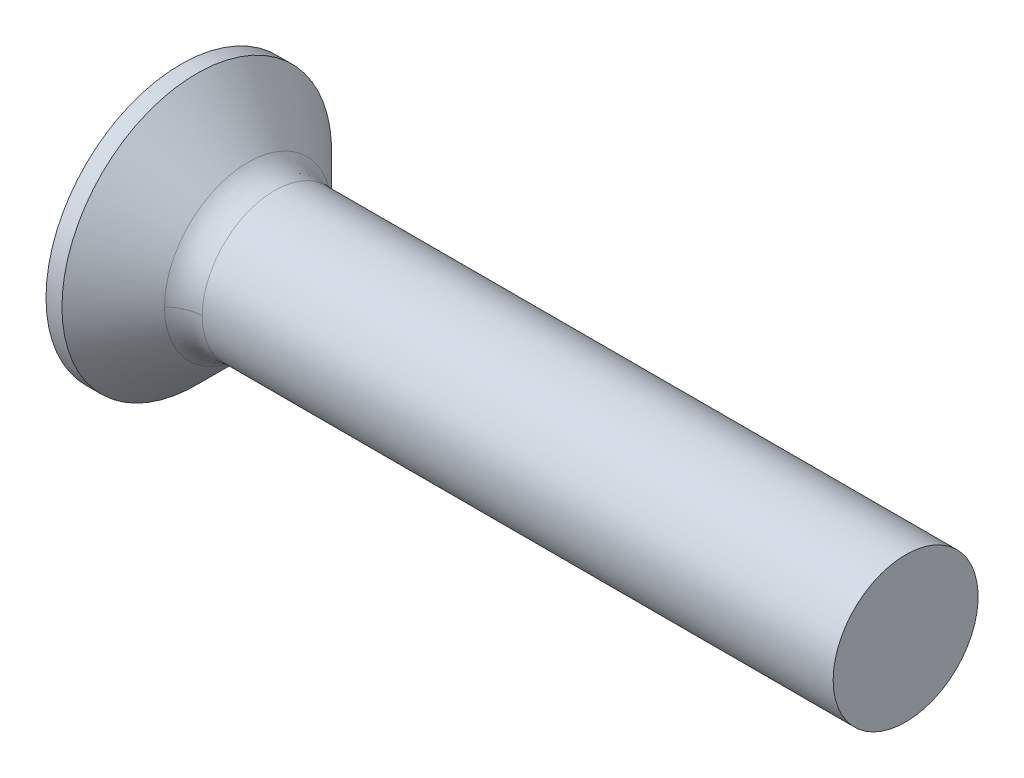
ISO-10303-21;
HEADER;
FILE_DESCRIPTION(('STEP AP214'),'2;1');
FILE_NAME('part.step','',(''),(''),'','','');
FILE_SCHEMA(('AUTOMOTIVE_DESIGN { 1 0 10303 214 1 1 1 1 }'));
ENDSEC;
DATA;
#1=APPLICATION_CONTEXT('core data for automotive mechanical design processes');
#2=APPLICATION_PROTOCOL_DEFINITION('international standard','automotive_design',2000,#1);
#3=PRODUCT_CONTEXT('',#1,'mechanical');
#4=PRODUCT('Part','Part','',(#3));
#5=PRODUCT_RELATED_PRODUCT_CATEGORY('part','',(#4));
#6=PRODUCT_DEFINITION_FORMATION('','',#4);
#7=PRODUCT_DEFINITION_CONTEXT('part definition',#1,'design');
#8=PRODUCT_DEFINITION('design','',#6,#7);
#9=PRODUCT_DEFINITION_SHAPE('','',#8);
#10=(LENGTH_UNIT() NAMED_UNIT(*) SI_UNIT(.MILLI.,.METRE.));
#11=(NAMED_UNIT(*) PLANE_ANGLE_UNIT() SI_UNIT($,.RADIAN.));
#12=(NAMED_UNIT(*) SI_UNIT($,.STERADIAN.) SOLID_ANGLE_UNIT());
#13=UNCERTAINTY_MEASURE_WITH_UNIT(LENGTH_MEASURE(1.E-05),#10,'distance_accuracy_value','');
#14=(GEOMETRIC_REPRESENTATION_CONTEXT(3) GLOBAL_UNCERTAINTY_ASSIGNED_CONTEXT((#13)) GLOBAL_UNIT_ASSIGNED_CONTEXT((#10,
#11,#12)) REPRESENTATION_CONTEXT('',''));
#15=CARTESIAN_POINT('',(0.,0.,0.));
#16=DIRECTION('',(0.,0.,1.));
#17=DIRECTION('',(1.,0.,0.));
#18=AXIS2_PLACEMENT_3D('',#15,#16,#17);
#19=CARTESIAN_POINT('',(3.05,0.,0.));
#20=DIRECTION('',(-1.,0.,0.));
#21=DIRECTION('',(0.,0.,1.));
#22=AXIS2_PLACEMENT_3D('',#19,#20,#21);
#23=CONICAL_SURFACE('',#22,0.851,0.0698131699402238);
#24=CARTESIAN_POINT('',(3.05,0.,0.));
#25=DIRECTION('',(-1.,0.,0.));
#26=DIRECTION('',(0.,0.,1.));
#27=AXIS2_PLACEMENT_3D('',#24,#25,#26);
#28=CIRCLE('',#27,0.851);
#29=CARTESIAN_POINT('',(3.05,0.515000000128447,-0.677477674811281));
#30=VERTEX_POINT('',#29);
#31=CARTESIAN_POINT('',(3.04999999998945,0.677477674911265,-0.514999999998138));
#32=VERTEX_POINT('',#31);
#33=EDGE_CURVE('E126',#30,#32,#28,.F.);
#34=ORIENTED_EDGE('',*,*,#33,.T.);
#35=CARTESIAN_POINT('',(-7.67570391463201E-11,0.931375357170448,-0.515));
#36=CARTESIAN_POINT('',(0.330572472848562,0.904946417906444,-0.515));
#37=CARTESIAN_POINT('',(0.661126771646041,0.878283148604802,-0.515));
#38=CARTESIAN_POINT('',(1.32217705983663,0.824265652939466,-0.515));
#39=CARTESIAN_POINT('',(1.65267304953057,0.796911430252112,-0.515));
#40=CARTESIAN_POINT('',(2.16096789406414,0.754133835706705,-0.515));
#41=CARTESIAN_POINT('',(2.33879401122227,0.739034945221815,-0.515));
#42=CARTESIAN_POINT('',(2.69441897396936,0.708513656055335,-0.515));
#43=CARTESIAN_POINT('',(2.87221781947904,0.693091256450383,-0.515));
#44=CARTESIAN_POINT('',(3.049999999979,0.677477674910982,-0.515));
#45=B_SPLINE_CURVE_WITH_KNOTS('',3,(#35,#36,#37,#38,#39,#40,#41,#42,#43,#44),.UNSPECIFIED.,.F.,
.F.,(4,2,2,2,4),(0.,0.994882626466528,1.98975996059805,2.52515761420332,3.06055679615058),.UNSPECIFIED.);
#46=CARTESIAN_POINT('',(0.,0.931375357164314,-0.515));
#47=VERTEX_POINT('',#46);
#48=EDGE_CURVE('E119',#47,#32,#45,.T.);
#49=ORIENTED_EDGE('',*,*,#48,.F.);
#50=CARTESIAN_POINT('',(0.,0.,0.));
#51=DIRECTION('',(-1.,0.,0.));
#52=DIRECTION('',(0.,0.,1.));
#53=AXIS2_PLACEMENT_3D('',#50,#51,#52);
#54=CIRCLE('',#53,1.064276776);
#55=CARTESIAN_POINT('',(-3.68055372291726E-11,0.515,-0.931375357167255));
#56=VERTEX_POINT('',#55);
#57=EDGE_CURVE('E20',#47,#56,#54,.T.);
#58=ORIENTED_EDGE('',*,*,#57,.T.);
#59=CARTESIAN_POINT('',(3.04999999998465,0.515,-0.677477674910271));
#60=CARTESIAN_POINT('',(2.78584457189711,0.515,-0.700667836997838));
#61=CARTESIAN_POINT('',(2.52165382800828,0.515,-0.723450546558568));
#62=CARTESIAN_POINT('',(1.9932175722748,0.515,-0.768360334127793));
#63=CARTESIAN_POINT('',(1.72897206064354,0.515,-0.79048741464414));
#64=CARTESIAN_POINT('',(1.2206193561181,0.515,-0.832574721749591));
#65=CARTESIAN_POINT('',(0.976515168975279,0.515,-0.852571390109687));
#66=CARTESIAN_POINT('',(0.488277611396775,0.515,-0.892216155988628));
#67=CARTESIAN_POINT('',(0.244144240861769,0.515,-0.911864252285126));
#68=CARTESIAN_POINT('',(-7.3606800830503E-11,0.515,-0.931375357170245));
#69=B_SPLINE_CURVE_WITH_KNOTS('',3,(#59,#60,#61,#62,#63,#64,#65,#66,#67,#68),.UNSPECIFIED.,.F.,
.F.,(4,2,2,2,4),(0.,0.795513252853999,1.59102346239218,2.3257888297006,3.06055677312136),.UNSPECIFIED.);
#70=EDGE_CURVE('E149',#30,#56,#69,.T.);
#71=ORIENTED_EDGE('',*,*,#70,.F.);
#72=EDGE_LOOP('',(#34,#49,#58,#71));
#73=FACE_BOUND('',#72,.T.);
#74=ADVANCED_FACE('F16',(#73),#23,.F.);
#75=CARTESIAN_POINT('',(0.,0.666842541,-0.515));
#76=DIRECTION('',(0.,0.,1.));
#77=DIRECTION('',(1.,0.,0.));
#78=AXIS2_PLACEMENT_3D('',#75,#76,#77);
#79=PLANE('',#78);
#80=DIRECTION('',(0.,1.,0.));
#81=VECTOR('',#80,1.);
#82=CARTESIAN_POINT('',(3.05,1.5637388375,-0.515));
#83=LINE('',#82,#81);
#84=CARTESIAN_POINT('',(3.05,0.929326148090736,-0.515));
#85=VERTEX_POINT('',#84);
#86=EDGE_CURVE('E140',#32,#85,#83,.T.);
#87=ORIENTED_EDGE('',*,*,#86,.T.);
#88=DIRECTION('',(0.894934367760736,-0.446197800757345,0.));
#89=VECTOR('',#88,1.);
#90=CARTESIAN_POINT('',(1.525,1.689663074,-0.515));
#91=LINE('',#90,#89);
#92=CARTESIAN_POINT('',(0.,2.44999999986994,-0.515));
#93=VERTEX_POINT('',#92);
#94=EDGE_CURVE('E123',#93,#85,#91,.T.);
#95=ORIENTED_EDGE('',*,*,#94,.F.);
#96=DIRECTION('',(0.,-1.,0.));
#97=VECTOR('',#96,1.);
#98=CARTESIAN_POINT('',(0.,1.5637388375,-0.515));
#99=LINE('',#98,#97);
#100=EDGE_CURVE('E114',#93,#47,#99,.T.);
#101=ORIENTED_EDGE('',*,*,#100,.T.);
#102=ORIENTED_EDGE('',*,*,#48,.T.);
#103=EDGE_LOOP('',(#87,#95,#101,#102));
#104=FACE_BOUND('',#103,.T.);
#105=ADVANCED_FACE('F117',(#104),#79,.T.);
#106=CARTESIAN_POINT('',(25.,-2.53,2.53));
#107=DIRECTION('',(1.,0.,0.));
#108=DIRECTION('',(0.,0.,-1.));
#109=AXIS2_PLACEMENT_3D('',#106,#107,#108);
#110=PLANE('',#109);
#111=CARTESIAN_POINT('',(25.,0.,0.));
#112=DIRECTION('',(-1.,0.,0.));
#113=DIRECTION('',(0.,0.,1.));
#114=AXIS2_PLACEMENT_3D('',#111,#112,#113);
#115=CIRCLE('',#114,2.5);
#116=CARTESIAN_POINT('',(25.,0.,2.5));
#117=VERTEX_POINT('',#116);
#118=EDGE_CURVE('E381',#117,#117,#115,.F.);
#119=ORIENTED_EDGE('',*,*,#118,.T.);
#120=EDGE_LOOP('',(#119));
#121=FACE_BOUND('',#120,.T.);
#122=ADVANCED_FACE('F520',(#121),#110,.T.);
#123=CARTESIAN_POINT('',(0.,0.515,-2.460635134));
#124=DIRECTION('',(0.,-1.,0.));
#125=DIRECTION('',(1.,0.,0.));
#126=AXIS2_PLACEMENT_3D('',#123,#124,#125);
#127=PLANE('',#126);
#128=DIRECTION('',(0.,0.,-1.));
#129=VECTOR('',#128,1.);
#130=CARTESIAN_POINT('',(0.,0.515,-1.5637388375));
#131=LINE('',#130,#129);
#132=CARTESIAN_POINT('',(0.,0.515,-2.44999999986994));
#133=VERTEX_POINT('',#132);
#134=EDGE_CURVE('E135',#56,#133,#131,.T.);
#135=ORIENTED_EDGE('',*,*,#134,.T.);
#136=DIRECTION('',(-0.894934367760736,0.,-0.446197800757345));
#137=VECTOR('',#136,1.);
#138=CARTESIAN_POINT('',(1.525,0.515,-1.689663074));
#139=LINE('',#138,#137);
#140=CARTESIAN_POINT('',(3.05,0.515,-0.929326148090736));
#141=VERTEX_POINT('',#140);
#142=EDGE_CURVE('E363',#141,#133,#139,.T.);
#143=ORIENTED_EDGE('',*,*,#142,.F.);
#144=DIRECTION('',(0.,0.,1.));
#145=VECTOR('',#144,1.);
#146=CARTESIAN_POINT('',(3.05,0.515,-1.5637388375));
#147=LINE('',#146,#145);
#148=EDGE_CURVE('E141',#141,#30,#147,.T.);
#149=ORIENTED_EDGE('',*,*,#148,.T.);
#150=ORIENTED_EDGE('',*,*,#70,.T.);
#151=EDGE_LOOP('',(#135,#143,#149,#150));
#152=FACE_BOUND('',#151,.T.);
#153=ADVANCED_FACE('F553',(#152),#127,.T.);
#154=CARTESIAN_POINT('',(0.,2.45,-0.515));
#155=DIRECTION('',(-0.446197800757345,-0.894934367760736,0.));
#156=DIRECTION('',(0.894934367760736,-0.446197800757345,0.));
#157=AXIS2_PLACEMENT_3D('',#154,#155,#156);
#158=PLANE('',#157);
#159=ORIENTED_EDGE('',*,*,#94,.T.);
#160=DIRECTION('',(0.,0.,1.));
#161=VECTOR('',#160,1.);
#162=CARTESIAN_POINT('',(3.05,0.929326148,0.));
#163=LINE('',#162,#161);
#164=CARTESIAN_POINT('',(3.05,0.929326148136104,0.515));
#165=VERTEX_POINT('',#164);
#166=EDGE_CURVE('E379',#85,#165,#163,.T.);
#167=ORIENTED_EDGE('',*,*,#166,.T.);
#168=DIRECTION('',(0.894934367838347,-0.446197800601682,0.));
#169=VECTOR('',#168,1.);
#170=CARTESIAN_POINT('',(0.,2.44999999960982,0.515));
#171=LINE('',#170,#169);
#172=CARTESIAN_POINT('',(0.,2.44999999980491,0.515));
#173=VERTEX_POINT('',#172);
#174=EDGE_CURVE('E353',#173,#165,#171,.T.);
#175=ORIENTED_EDGE('',*,*,#174,.F.);
#176=DIRECTION('',(0.,0.,-1.));
#177=VECTOR('',#176,1.);
#178=CARTESIAN_POINT('',(0.,2.45,0.));
#179=LINE('',#178,#177);
#180=EDGE_CURVE('E374',#173,#93,#179,.T.);
#181=ORIENTED_EDGE('',*,*,#180,.T.);
#182=EDGE_LOOP('',(#159,#167,#175,#181));
#183=FACE_BOUND('',#182,.T.);
#184=ADVANCED_FACE('F165',(#183),#158,.T.);
#185=CARTESIAN_POINT('',(25.,0.,0.));
#186=DIRECTION('',(-1.,0.,0.));
#187=DIRECTION('',(0.,0.,1.));
#188=AXIS2_PLACEMENT_3D('',#185,#186,#187);
#189=CYLINDRICAL_SURFACE('',#188,2.5);
#190=ORIENTED_EDGE('',*,*,#118,.F.);
#191=EDGE_LOOP('',(#190));
#192=FACE_BOUND('',#191,.T.);
#193=CARTESIAN_POINT('',(3.23847763096331,0.,0.));
#194=DIRECTION('',(1.,0.,0.));
#195=DIRECTION('',(0.,1.,0.));
#196=AXIS2_PLACEMENT_3D('',#193,#194,#195);
#197=CIRCLE('',#196,2.49999999985679);
#198=CARTESIAN_POINT('',(3.23847763096991,-2.56379285644164E-10,-2.49999999989259));
#199=VERTEX_POINT('',#198);
#200=CARTESIAN_POINT('',(3.23847763095945,-1.12242035535916E-10,2.49999999989259));
#201=VERTEX_POINT('',#200);
#202=EDGE_CURVE('E343',#199,#201,#197,.T.);
#203=ORIENTED_EDGE('',*,*,#202,.T.);
#204=CARTESIAN_POINT('',(3.23847763096331,0.,0.));
#205=DIRECTION('',(1.,0.,0.));
#206=DIRECTION('',(0.,1.,0.));
#207=AXIS2_PLACEMENT_3D('',#204,#205,#206);
#208=CIRCLE('',#207,2.49999999985679);
#209=EDGE_CURVE('E332',#201,#199,#208,.T.);
#210=ORIENTED_EDGE('',*,*,#209,.T.);
#211=EDGE_LOOP('',(#203,#210));
#212=FACE_BOUND('',#211,.T.);
#213=ADVANCED_FACE('F160',(#192,#212),#189,.T.);
#214=CARTESIAN_POINT('',(3.05,0.515,-0.929326148));
#215=DIRECTION('',(-0.446197800757345,0.,0.894934367760736));
#216=DIRECTION('',(-0.894934367760736,0.,-0.446197800757345));
#217=AXIS2_PLACEMENT_3D('',#214,#215,#216);
#218=PLANE('',#217);
#219=DIRECTION('',(-0.894934367838347,0.,-0.446197800601682));
#220=VECTOR('',#219,1.);
#221=CARTESIAN_POINT('',(3.05,-0.515,-0.929326148272208));
#222=LINE('',#221,#220);
#223=CARTESIAN_POINT('',(3.05,-0.515,-0.929326148136104));
#224=VERTEX_POINT('',#223);
#225=CARTESIAN_POINT('',(0.,-0.515,-2.44999999980491));
#226=VERTEX_POINT('',#225);
#227=EDGE_CURVE('E318',#224,#226,#222,.T.);
#228=ORIENTED_EDGE('',*,*,#227,.F.);
#229=DIRECTION('',(0.,1.,0.));
#230=VECTOR('',#229,1.);
#231=CARTESIAN_POINT('',(3.05,0.,-0.929326148));
#232=LINE('',#231,#230);
#233=EDGE_CURVE('E356',#224,#141,#232,.T.);
#234=ORIENTED_EDGE('',*,*,#233,.T.);
#235=ORIENTED_EDGE('',*,*,#142,.T.);
#236=DIRECTION('',(0.,-1.,0.));
#237=VECTOR('',#236,1.);
#238=CARTESIAN_POINT('',(0.,0.,-2.45));
#239=LINE('',#238,#237);
#240=EDGE_CURVE('E359',#133,#226,#239,.T.);
#241=ORIENTED_EDGE('',*,*,#240,.T.);
#242=EDGE_LOOP('',(#228,#234,#235,#241));
#243=FACE_BOUND('',#242,.T.);
#244=ADVANCED_FACE('F164',(#243),#218,.T.);
#245=CARTESIAN_POINT('',(0.,0.666842541,0.515));
#246=DIRECTION('',(0.,0.,-1.));
#247=DIRECTION('',(0.,1.,0.));
#248=AXIS2_PLACEMENT_3D('',#245,#246,#247);
#249=PLANE('',#248);
#250=DIRECTION('',(0.,1.,0.));
#251=VECTOR('',#250,1.);
#252=CARTESIAN_POINT('',(0.,1.5637388375,0.515));
#253=LINE('',#252,#251);
#254=CARTESIAN_POINT('',(0.,0.931375357164314,0.515));
#255=VERTEX_POINT('',#254);
#256=EDGE_CURVE('E348',#255,#173,#253,.T.);
#257=ORIENTED_EDGE('',*,*,#256,.T.);
#258=ORIENTED_EDGE('',*,*,#174,.T.);
#259=DIRECTION('',(0.,-1.,0.));
#260=VECTOR('',#259,1.);
#261=CARTESIAN_POINT('',(3.05,1.5637388375,0.515));
#262=LINE('',#261,#260);
#263=CARTESIAN_POINT('',(3.05,0.677477675015967,0.514999999859184));
#264=VERTEX_POINT('',#263);
#265=EDGE_CURVE('E354',#165,#264,#262,.T.);
#266=ORIENTED_EDGE('',*,*,#265,.T.);
#267=CARTESIAN_POINT('',(-8.40686860052449E-11,0.931375357171032,0.515));
#268=CARTESIAN_POINT('',(0.330572472841409,0.90494641790702,0.515));
#269=CARTESIAN_POINT('',(0.661126771639048,0.878283148605369,0.515));
#270=CARTESIAN_POINT('',(1.32217705982996,0.824265652940016,0.515));
#271=CARTESIAN_POINT('',(1.65267304952405,0.796911430252655,0.515));
#272=CARTESIAN_POINT('',(2.16096789405845,0.754133835707187,0.515));
#273=CARTESIAN_POINT('',(2.33879401121725,0.739034945222243,0.515));
#274=CARTESIAN_POINT('',(2.69441897396568,0.708513656055654,0.515));
#275=CARTESIAN_POINT('',(2.87221781947602,0.693091256450646,0.515));
#276=CARTESIAN_POINT('',(3.04999999997665,0.677477674911189,0.515));
#277=B_SPLINE_CURVE_WITH_KNOTS('',3,(#267,#268,#269,#270,#271,#272,#273,#274,#275,#276),
.UNSPECIFIED.,.F.,.F.,(4,2,2,2,4),(0.,0.994882626467006,1.98975996059901,2.52515761420628,
3.06055679615556),.UNSPECIFIED.);
#278=EDGE_CURVE('E200',#255,#264,#277,.T.);
#279=ORIENTED_EDGE('',*,*,#278,.F.);
#280=EDGE_LOOP('',(#257,#258,#266,#279));
#281=FACE_BOUND('',#280,.T.);
#282=ADVANCED_FACE('F173',(#281),#249,.T.);
#283=CARTESIAN_POINT('',(3.368261073,0.,2.506494585));
#284=CARTESIAN_POINT('',(3.368261073,5.01298917,2.506494585));
#285=CARTESIAN_POINT('',(3.368261073,5.01298917,-2.506494585));
#286=CARTESIAN_POINT('',(3.368261073,0.,-2.506494585));
#287=CARTESIAN_POINT('',(2.925242194,0.,2.462044431));
#288=CARTESIAN_POINT('',(2.925242194,4.924088862,2.462044431));
#289=CARTESIAN_POINT('',(2.925242194,4.924088862,-2.462044431));
#290=CARTESIAN_POINT('',(2.925242194,0.,-2.462044431));
#291=CARTESIAN_POINT('',(2.513891077,0.,2.632431643));
#292=CARTESIAN_POINT('',(2.513891077,5.264863285,2.632431643));
#293=CARTESIAN_POINT('',(2.513891077,5.264863285,-2.632431643));
#294=CARTESIAN_POINT('',(2.513891077,0.,-2.632431643));
#295=CARTESIAN_POINT('',(2.232060429,0.,2.977124301));
#296=CARTESIAN_POINT('',(2.232060429,5.954248603,2.977124301));
#297=CARTESIAN_POINT('',(2.232060429,5.954248603,-2.977124301));
#298=CARTESIAN_POINT('',(2.232060429,0.,-2.977124301));
#299=(BOUNDED_SURFACE() B_SPLINE_SURFACE(3,3,((#283,#284,#285,#286),(#287,#288,#289,#290),(#291,
#292,#293,#294),(#295,#296,#297,#298)),.UNSPECIFIED.,.F.,.F.,
.F.) B_SPLINE_SURFACE_WITH_KNOTS((4,4),(4,4),(0.,1.),(0.,1.),
.UNSPECIFIED.) GEOMETRIC_REPRESENTATION_ITEM() RATIONAL_B_SPLINE_SURFACE(((1.,0.333333333333333,
0.333333333333333,1.),(0.920706259011135,0.306902086337045,0.306902086337045,0.920706259011135),
(0.920706259011135,0.306902086337045,0.306902086337045,0.920706259011135),(1.,0.333333333333333,
0.333333333333333,1.))) REPRESENTATION_ITEM('') SURFACE());
#300=CARTESIAN_POINT('',(2.31923881600005,0.,0.));
#301=DIRECTION('',(-1.,0.,0.));
#302=DIRECTION('',(0.,0.,1.));
#303=AXIS2_PLACEMENT_3D('',#300,#301,#302);
#304=CIRCLE('',#303,2.880761184);
#305=CARTESIAN_POINT('',(2.319238815924,-8.86280993358422E-10,-2.88076118401307));
#306=VERTEX_POINT('',#305);
#307=CARTESIAN_POINT('',(2.31923881597038,-2.58673999348011E-10,2.88076118396668));
#308=VERTEX_POINT('',#307);
#309=EDGE_CURVE('E304',#306,#308,#304,.F.);
#310=CARTESIAN_POINT('',(3.368261073,0.,2.506494585));
#311=CARTESIAN_POINT('',(2.925242194,0.,2.462044431));
#312=CARTESIAN_POINT('',(2.513891077,0.,2.632431643));
#313=CARTESIAN_POINT('',(2.232060429,0.,2.977124301));
#314=(BOUNDED_CURVE() B_SPLINE_CURVE(3,(#310,#311,#312,#313),.UNSPECIFIED.,.F.,
.F.) B_SPLINE_CURVE_WITH_KNOTS((4,4),(0.,1.),
.UNSPECIFIED.) CURVE() GEOMETRIC_REPRESENTATION_ITEM() RATIONAL_B_SPLINE_CURVE((1.,
0.920706259011135,0.920706259011135,1.)) REPRESENTATION_ITEM(''));
#315=EDGE_CURVE('E337',#308,#201,#314,.F.);
#316=CARTESIAN_POINT('',(3.368261073,0.,-2.506494585));
#317=CARTESIAN_POINT('',(2.925242194,0.,-2.462044431));
#318=CARTESIAN_POINT('',(2.513891077,0.,-2.632431643));
#319=CARTESIAN_POINT('',(2.232060429,0.,-2.977124301));
#320=(BOUNDED_CURVE() B_SPLINE_CURVE(3,(#316,#317,#318,#319),.UNSPECIFIED.,.F.,
.F.) B_SPLINE_CURVE_WITH_KNOTS((4,4),(0.,1.),
.UNSPECIFIED.) CURVE() GEOMETRIC_REPRESENTATION_ITEM() RATIONAL_B_SPLINE_CURVE((1.,
0.920706259011135,0.920706259011135,1.)) REPRESENTATION_ITEM(''));
#321=EDGE_CURVE('E323',#199,#306,#320,.T.);
#322=ORIENTED_EDGE('',*,*,#309,.T.);
#323=ORIENTED_EDGE('',*,*,#315,.T.);
#324=ORIENTED_EDGE('',*,*,#202,.F.);
#325=ORIENTED_EDGE('',*,*,#321,.T.);
#326=EDGE_LOOP('',(#322,#323,#324,#325));
#327=FACE_BOUND('',#326,.T.);
#328=ADVANCED_FACE('F167',(#327),#299,.F.);
#329=CARTESIAN_POINT('',(3.368261073,0.,-2.506494585));
#330=CARTESIAN_POINT('',(3.368261073,-5.01298917,-2.506494585));
#331=CARTESIAN_POINT('',(3.368261073,-5.01298917,2.506494585));
#332=CARTESIAN_POINT('',(3.368261073,0.,2.506494585));
#333=CARTESIAN_POINT('',(2.925242194,0.,-2.462044431));
#334=CARTESIAN_POINT('',(2.925242194,-4.924088862,-2.462044431));
#335=CARTESIAN_POINT('',(2.925242194,-4.924088862,2.462044431));
#336=CARTESIAN_POINT('',(2.925242194,0.,2.462044431));
#337=CARTESIAN_POINT('',(2.513891077,0.,-2.632431643));
#338=CARTESIAN_POINT('',(2.513891077,-5.264863285,-2.632431643));
#339=CARTESIAN_POINT('',(2.513891077,-5.264863285,2.632431643));
#340=CARTESIAN_POINT('',(2.513891077,0.,2.632431643));
#341=CARTESIAN_POINT('',(2.232060429,0.,-2.977124301));
#342=CARTESIAN_POINT('',(2.232060429,-5.954248603,-2.977124301));
#343=CARTESIAN_POINT('',(2.232060429,-5.954248603,2.977124301));
#344=CARTESIAN_POINT('',(2.232060429,0.,2.977124301));
#345=(BOUNDED_SURFACE() B_SPLINE_SURFACE(3,3,((#329,#330,#331,#332),(#333,#334,#335,#336),(#337,
#338,#339,#340),(#341,#342,#343,#344)),.UNSPECIFIED.,.F.,.F.,
.F.) B_SPLINE_SURFACE_WITH_KNOTS((4,4),(4,4),(0.,1.),(0.,1.),
.UNSPECIFIED.) GEOMETRIC_REPRESENTATION_ITEM() RATIONAL_B_SPLINE_SURFACE(((1.,0.333333333333333,
0.333333333333333,1.),(0.920706259011135,0.306902086337045,0.306902086337045,0.920706259011135),
(0.920706259011135,0.306902086337045,0.306902086337045,0.920706259011135),(1.,0.333333333333333,
0.333333333333333,1.))) REPRESENTATION_ITEM('') SURFACE());
#346=CARTESIAN_POINT('',(2.31923881600005,0.,0.));
#347=DIRECTION('',(-1.,0.,0.));
#348=DIRECTION('',(0.,0.,1.));
#349=AXIS2_PLACEMENT_3D('',#346,#347,#348);
#350=CIRCLE('',#349,2.880761184);
#351=EDGE_CURVE('E298',#308,#306,#350,.F.);
#352=ORIENTED_EDGE('',*,*,#321,.F.);
#353=ORIENTED_EDGE('',*,*,#209,.F.);
#354=ORIENTED_EDGE('',*,*,#315,.F.);
#355=ORIENTED_EDGE('',*,*,#351,.T.);
#356=EDGE_LOOP('',(#352,#353,#354,#355));
#357=FACE_BOUND('',#356,.T.);
#358=ADVANCED_FACE('F172',(#357),#345,.F.);
#359=CARTESIAN_POINT('',(0.,-0.515,-2.460635134));
#360=DIRECTION('',(0.,1.,0.));
#361=DIRECTION('',(0.,0.,1.));
#362=AXIS2_PLACEMENT_3D('',#359,#360,#361);
#363=PLANE('',#362);
#364=DIRECTION('',(0.,0.,-1.));
#365=VECTOR('',#364,1.);
#366=CARTESIAN_POINT('',(3.05,-0.515,-1.5637388375));
#367=LINE('',#366,#365);
#368=CARTESIAN_POINT('',(3.05,-0.515000000067614,-0.67747767485753));
#369=VERTEX_POINT('',#368);
#370=EDGE_CURVE('E319',#369,#224,#367,.T.);
#371=ORIENTED_EDGE('',*,*,#370,.T.);
#372=ORIENTED_EDGE('',*,*,#227,.T.);
#373=DIRECTION('',(0.,0.,1.));
#374=VECTOR('',#373,1.);
#375=CARTESIAN_POINT('',(0.,-0.515,-1.5637388375));
#376=LINE('',#375,#374);
#377=CARTESIAN_POINT('',(-3.70023635906891E-11,-0.515,-0.93137535716727));
#378=VERTEX_POINT('',#377);
#379=EDGE_CURVE('E321',#226,#378,#376,.T.);
#380=ORIENTED_EDGE('',*,*,#379,.T.);
#381=CARTESIAN_POINT('',(3.04999999999045,-0.515,-0.677477674909761));
#382=CARTESIAN_POINT('',(2.78584457190303,-0.515,-0.700667836997324));
#383=CARTESIAN_POINT('',(2.52165382801433,-0.515,-0.723450546558049));
#384=CARTESIAN_POINT('',(1.99321757228111,-0.515,-0.768360334127263));
#385=CARTESIAN_POINT('',(1.72897206064996,-0.515,-0.790487414643603));
#386=CARTESIAN_POINT('',(1.22061935612349,-0.515,-0.832574721749148));
#387=CARTESIAN_POINT('',(0.976515168979518,-0.515,-0.852571390109341));
#388=CARTESIAN_POINT('',(0.488277611398697,-0.515,-0.892216155988473));
#389=CARTESIAN_POINT('',(0.244144240862533,-0.515,-0.911864252285065));
#390=CARTESIAN_POINT('',(-7.40009102619692E-11,-0.515,-0.931375357170277));
#391=B_SPLINE_CURVE_WITH_KNOTS('',3,(#381,#382,#383,#384,#385,#386,#387,#388,#389,#390),
.UNSPECIFIED.,.F.,.F.,(4,2,2,2,4),(0.,0.79551325285362,1.59102346239142,2.32578882970333,
3.06055677312757),.UNSPECIFIED.);
#392=EDGE_CURVE('E290',#369,#378,#391,.T.);
#393=ORIENTED_EDGE('',*,*,#392,.F.);
#394=EDGE_LOOP('',(#371,#372,#380,#393));
#395=FACE_BOUND('',#394,.T.);
#396=ADVANCED_FACE('F184',(#395),#363,.T.);
#397=CARTESIAN_POINT('',(3.05,0.,0.));
#398=DIRECTION('',(-1.,0.,0.));
#399=DIRECTION('',(0.,0.,1.));
#400=AXIS2_PLACEMENT_3D('',#397,#398,#399);
#401=CONICAL_SURFACE('',#400,0.851,0.0698131699402238);
#402=CARTESIAN_POINT('',(0.,0.,0.));
#403=DIRECTION('',(-1.,0.,0.));
#404=DIRECTION('',(0.,0.,1.));
#405=AXIS2_PLACEMENT_3D('',#402,#403,#404);
#406=CIRCLE('',#405,1.064276776);
#407=CARTESIAN_POINT('',(0.,0.515,0.931375357164314));
#408=VERTEX_POINT('',#407);
#409=EDGE_CURVE('E317',#408,#255,#406,.T.);
#410=ORIENTED_EDGE('',*,*,#409,.T.);
#411=ORIENTED_EDGE('',*,*,#278,.T.);
#412=CARTESIAN_POINT('',(3.05,0.,0.));
#413=DIRECTION('',(-1.,0.,0.));
#414=DIRECTION('',(0.,0.,1.));
#415=AXIS2_PLACEMENT_3D('',#412,#413,#414);
#416=CIRCLE('',#415,0.851);
#417=CARTESIAN_POINT('',(3.04999999998791,0.514999999928661,0.677477674964214));
#418=VERTEX_POINT('',#417);
#419=EDGE_CURVE('E314',#264,#418,#416,.F.);
#420=ORIENTED_EDGE('',*,*,#419,.T.);
#421=CARTESIAN_POINT('',(-7.84343790706511E-11,0.515,0.931375357170582));
#422=CARTESIAN_POINT('',(0.330572472846921,0.515,0.904946417906576));
#423=CARTESIAN_POINT('',(0.661126771644437,0.515,0.878283148604932));
#424=CARTESIAN_POINT('',(1.3221770598351,0.515,0.824265652939592));
#425=CARTESIAN_POINT('',(1.65267304952907,0.515,0.796911430252237));
#426=CARTESIAN_POINT('',(2.1609678940624,0.515,0.754133835706851));
#427=CARTESIAN_POINT('',(2.33879401122026,0.515,0.739034945221986));
#428=CARTESIAN_POINT('',(2.6944189739668,0.515,0.708513656055556));
#429=CARTESIAN_POINT('',(2.8722178194762,0.515,0.69309125645063));
#430=CARTESIAN_POINT('',(3.04999999997588,0.515,0.677477674911256));
#431=B_SPLINE_CURVE_WITH_KNOTS('',3,(#421,#422,#423,#424,#425,#426,#427,#428,#429,#430),
.UNSPECIFIED.,.F.,.F.,(4,2,2,2,4),(0.,0.994882626466638,1.98975996059827,2.52515761420271,
3.06055679614914),.UNSPECIFIED.);
#432=EDGE_CURVE('E208',#408,#418,#431,.T.);
#433=ORIENTED_EDGE('',*,*,#432,.F.);
#434=EDGE_LOOP('',(#410,#411,#420,#433));
#435=FACE_BOUND('',#434,.T.);
#436=ADVANCED_FACE('F186',(#435),#401,.F.);
#437=CARTESIAN_POINT('',(2.319238816,0.,0.));
#438=DIRECTION('',(-1.,0.,0.));
#439=DIRECTION('',(0.,0.,1.));
#440=AXIS2_PLACEMENT_3D('',#437,#438,#439);
#441=CONICAL_SURFACE('',#440,2.880761184,0.785398163397448);
#442=ORIENTED_EDGE('',*,*,#351,.F.);
#443=ORIENTED_EDGE('',*,*,#309,.F.);
#444=EDGE_LOOP('',(#442,#443));
#445=FACE_BOUND('',#444,.T.);
#446=CARTESIAN_POINT('',(0.55,0.,0.));
#447=DIRECTION('',(-1.,0.,0.));
#448=DIRECTION('',(0.,0.,1.));
#449=AXIS2_PLACEMENT_3D('',#446,#447,#448);
#450=CIRCLE('',#449,4.65);
#451=CARTESIAN_POINT('',(0.55,0.,4.65));
#452=VERTEX_POINT('',#451);
#453=EDGE_CURVE('E310',#452,#452,#450,.F.);
#454=ORIENTED_EDGE('',*,*,#453,.T.);
#455=EDGE_LOOP('',(#454));
#456=FACE_BOUND('',#455,.T.);
#457=ADVANCED_FACE('F195',(#445,#456),#441,.T.);
#458=CARTESIAN_POINT('',(3.05,0.,0.));
#459=DIRECTION('',(-1.,0.,0.));
#460=DIRECTION('',(0.,0.,1.));
#461=AXIS2_PLACEMENT_3D('',#458,#459,#460);
#462=CONICAL_SURFACE('',#461,0.851,0.0698131699402238);
#463=CARTESIAN_POINT('',(0.,0.,0.));
#464=DIRECTION('',(-1.,0.,0.));
#465=DIRECTION('',(0.,0.,1.));
#466=AXIS2_PLACEMENT_3D('',#463,#464,#465);
#467=CIRCLE('',#466,1.064276776);
#468=CARTESIAN_POINT('',(-7.43551893628162E-11,-0.93137535611612,-0.5150000019064));
#469=VERTEX_POINT('',#468);
#470=EDGE_CURVE('E224',#378,#469,#467,.T.);
#471=ORIENTED_EDGE('',*,*,#470,.T.);
#472=CARTESIAN_POINT('',(3.04999999998159,-0.67747767491054,-0.515));
#473=CARTESIAN_POINT('',(2.78584457189397,-0.70066783699811,-0.515));
#474=CARTESIAN_POINT('',(2.52165382800508,-0.723450546558843,-0.515));
#475=CARTESIAN_POINT('',(1.99321757227147,-0.768360334128074,-0.515));
#476=CARTESIAN_POINT('',(1.72897206064013,-0.790487414644424,-0.515));
#477=CARTESIAN_POINT('',(1.22061935610269,-0.832574721750865,-0.515));
#478=CARTESIAN_POINT('',(0.976515168947937,-0.852571390111926,-0.515));
#479=CARTESIAN_POINT('',(0.488277611345555,-0.892216155992768,-0.515));
#480=CARTESIAN_POINT('',(0.244144240798611,-0.911864252290202,-0.515));
#481=CARTESIAN_POINT('',(-1.4870572436423E-10,-0.931375357176246,-0.515));
#482=B_SPLINE_CURVE_WITH_KNOTS('',3,(#472,#473,#474,#475,#476,#477,#478,#479,#480,#481),
.UNSPECIFIED.,.F.,.F.,(4,2,2,2,4),(0.,0.795513252854199,1.59102346239258,2.32578882973693,
3.06055677319361),.UNSPECIFIED.);
#483=CARTESIAN_POINT('',(3.05,-0.677477674864095,-0.51500000005897));
#484=VERTEX_POINT('',#483);
#485=EDGE_CURVE('E218',#484,#469,#482,.T.);
#486=ORIENTED_EDGE('',*,*,#485,.F.);
#487=CARTESIAN_POINT('',(3.05,0.,0.));
#488=DIRECTION('',(-1.,0.,0.));
#489=DIRECTION('',(0.,0.,1.));
#490=AXIS2_PLACEMENT_3D('',#487,#488,#489);
#491=CIRCLE('',#490,0.851);
#492=EDGE_CURVE('E295',#484,#369,#491,.F.);
#493=ORIENTED_EDGE('',*,*,#492,.T.);
#494=ORIENTED_EDGE('',*,*,#392,.T.);
#495=EDGE_LOOP('',(#471,#486,#493,#494));
#496=FACE_BOUND('',#495,.T.);
#497=ADVANCED_FACE('F230',(#496),#462,.F.);
#498=CARTESIAN_POINT('',(0.,0.515,0.666842541));
#499=DIRECTION('',(0.,-1.,0.));
#500=DIRECTION('',(1.,0.,0.));
#501=AXIS2_PLACEMENT_3D('',#498,#499,#500);
#502=PLANE('',#501);
#503=DIRECTION('',(0.,0.,1.));
#504=VECTOR('',#503,1.);
#505=CARTESIAN_POINT('',(3.05,0.515,1.5637388375));
#506=LINE('',#505,#504);
#507=CARTESIAN_POINT('',(3.05,0.515,0.929326148090736));
#508=VERTEX_POINT('',#507);
#509=EDGE_CURVE('E216',#418,#508,#506,.T.);
#510=ORIENTED_EDGE('',*,*,#509,.T.);
#511=DIRECTION('',(0.894934367760736,0.,-0.446197800757345));
#512=VECTOR('',#511,1.);
#513=CARTESIAN_POINT('',(1.525,0.515,1.689663074));
#514=LINE('',#513,#512);
#515=CARTESIAN_POINT('',(-5.65647283063779E-10,0.515000001270933,2.4500000015685));
#516=VERTEX_POINT('',#515);
#517=EDGE_CURVE('E455',#516,#508,#514,.T.);
#518=ORIENTED_EDGE('',*,*,#517,.F.);
#519=DIRECTION('',(0.,0.,-1.));
#520=VECTOR('',#519,1.);
#521=CARTESIAN_POINT('',(0.,0.515,1.5637388375));
#522=LINE('',#521,#520);
#523=EDGE_CURVE('E217',#516,#408,#522,.T.);
#524=ORIENTED_EDGE('',*,*,#523,.T.);
#525=ORIENTED_EDGE('',*,*,#432,.T.);
#526=EDGE_LOOP('',(#510,#518,#524,#525));
#527=FACE_BOUND('',#526,.T.);
#528=ADVANCED_FACE('F225',(#527),#502,.T.);
#529=CARTESIAN_POINT('',(0.55,0.,0.));
#530=DIRECTION('',(-1.,0.,0.));
#531=DIRECTION('',(0.,0.,1.));
#532=AXIS2_PLACEMENT_3D('',#529,#530,#531);
#533=CYLINDRICAL_SURFACE('',#532,4.65);
#534=ORIENTED_EDGE('',*,*,#453,.F.);
#535=EDGE_LOOP('',(#534));
#536=FACE_BOUND('',#535,.T.);
#537=CARTESIAN_POINT('',(0.,0.,0.));
#538=DIRECTION('',(-1.,0.,0.));
#539=DIRECTION('',(0.,0.,1.));
#540=AXIS2_PLACEMENT_3D('',#537,#538,#539);
#541=CIRCLE('',#540,4.65);
#542=CARTESIAN_POINT('',(0.,0.,4.65));
#543=VERTEX_POINT('',#542);
#544=EDGE_CURVE('E454',#543,#543,#541,.T.);
#545=ORIENTED_EDGE('',*,*,#544,.F.);
#546=EDGE_LOOP('',(#545));
#547=FACE_BOUND('',#546,.T.);
#548=ADVANCED_FACE('F229',(#536,#547),#533,.T.);
#549=CARTESIAN_POINT('',(0.,-2.460635134,-0.515));
#550=DIRECTION('',(0.,0.,1.));
#551=DIRECTION('',(1.,0.,0.));
#552=AXIS2_PLACEMENT_3D('',#549,#550,#551);
#553=PLANE('',#552);
#554=DIRECTION('',(0.,1.,0.));
#555=VECTOR('',#554,1.);
#556=CARTESIAN_POINT('',(0.,0.,-0.5150000038128));
#557=LINE('',#556,#555);
#558=CARTESIAN_POINT('',(0.,-2.45000000141653,-0.515000001270933));
#559=VERTEX_POINT('',#558);
#560=EDGE_CURVE('E443',#559,#469,#557,.T.);
#561=ORIENTED_EDGE('',*,*,#560,.F.);
#562=DIRECTION('',(-0.894934367760736,-0.446197800757345,0.));
#563=VECTOR('',#562,1.);
#564=CARTESIAN_POINT('',(1.525,-1.689663074,-0.515));
#565=LINE('',#564,#563);
#566=CARTESIAN_POINT('',(3.05,-0.929326148090736,-0.515));
#567=VERTEX_POINT('',#566);
#568=EDGE_CURVE('E440',#567,#559,#565,.T.);
#569=ORIENTED_EDGE('',*,*,#568,.F.);
#570=DIRECTION('',(0.,1.,0.));
#571=VECTOR('',#570,1.);
#572=CARTESIAN_POINT('',(3.05,-1.5637388375,-0.515));
#573=LINE('',#572,#571);
#574=EDGE_CURVE('E313',#567,#484,#573,.T.);
#575=ORIENTED_EDGE('',*,*,#574,.T.);
#576=ORIENTED_EDGE('',*,*,#485,.T.);
#577=EDGE_LOOP('',(#561,#569,#575,#576));
#578=FACE_BOUND('',#577,.T.);
#579=ADVANCED_FACE('F233',(#578),#553,.T.);
#580=CARTESIAN_POINT('',(0.,0.515,2.45));
#581=DIRECTION('',(-0.446197800757345,0.,-0.894934367760736));
#582=DIRECTION('',(0.894934367760736,0.,-0.446197800757345));
#583=AXIS2_PLACEMENT_3D('',#580,#581,#582);
#584=PLANE('',#583);
#585=ORIENTED_EDGE('',*,*,#517,.T.);
#586=DIRECTION('',(0.,-1.,0.));
#587=VECTOR('',#586,1.);
#588=CARTESIAN_POINT('',(3.05,0.,0.929326148));
#589=LINE('',#588,#587);
#590=CARTESIAN_POINT('',(3.05,-0.515,0.929326148136104));
#591=VERTEX_POINT('',#590);
#592=EDGE_CURVE('E452',#508,#591,#589,.T.);
#593=ORIENTED_EDGE('',*,*,#592,.T.);
#594=DIRECTION('',(0.894934367838347,0.,-0.446197800601682));
#595=VECTOR('',#594,1.);
#596=CARTESIAN_POINT('',(0.,-0.515,2.44999999960982));
#597=LINE('',#596,#595);
#598=CARTESIAN_POINT('',(0.,-0.515,2.45000000192971));
#599=VERTEX_POINT('',#598);
#600=EDGE_CURVE('E423',#599,#591,#597,.T.);
#601=ORIENTED_EDGE('',*,*,#600,.F.);
#602=DIRECTION('',(0.,-1.,0.));
#603=VECTOR('',#602,1.);
#604=CARTESIAN_POINT('',(0.,0.,2.4500000042496));
#605=LINE('',#604,#603);
#606=EDGE_CURVE('E446',#516,#599,#605,.T.);
#607=ORIENTED_EDGE('',*,*,#606,.F.);
#608=EDGE_LOOP('',(#585,#593,#601,#607));
#609=FACE_BOUND('',#608,.T.);
#610=ADVANCED_FACE('F237',(#609),#584,.T.);
#611=CARTESIAN_POINT('',(0.,-4.7058,-4.7058));
#612=DIRECTION('',(-1.,0.,0.));
#613=DIRECTION('',(0.,0.,1.));
#614=AXIS2_PLACEMENT_3D('',#611,#612,#613);
#615=PLANE('',#614);
#616=ORIENTED_EDGE('',*,*,#523,.F.);
#617=ORIENTED_EDGE('',*,*,#606,.T.);
#618=DIRECTION('',(0.,0.,1.));
#619=VECTOR('',#618,1.);
#620=CARTESIAN_POINT('',(0.,-0.515,1.5637388375));
#621=LINE('',#620,#619);
#622=CARTESIAN_POINT('',(0.,-0.515,0.931375357164314));
#623=VERTEX_POINT('',#622);
#624=EDGE_CURVE('E425',#623,#599,#621,.T.);
#625=ORIENTED_EDGE('',*,*,#624,.F.);
#626=CARTESIAN_POINT('',(0.,0.,0.));
#627=DIRECTION('',(-1.,0.,0.));
#628=DIRECTION('',(0.,0.,1.));
#629=AXIS2_PLACEMENT_3D('',#626,#627,#628);
#630=CIRCLE('',#629,1.064276776);
#631=CARTESIAN_POINT('',(0.,-0.931375357164314,0.515));
#632=VERTEX_POINT('',#631);
#633=EDGE_CURVE('E411',#623,#632,#630,.F.);
#634=ORIENTED_EDGE('',*,*,#633,.T.);
#635=DIRECTION('',(0.,1.,0.));
#636=VECTOR('',#635,1.);
#637=CARTESIAN_POINT('',(0.,-1.5637388375,0.515));
#638=LINE('',#637,#636);
#639=CARTESIAN_POINT('',(0.,-2.44999999980491,0.515));
#640=VERTEX_POINT('',#639);
#641=EDGE_CURVE('E419',#640,#632,#638,.T.);
#642=ORIENTED_EDGE('',*,*,#641,.F.);
#643=DIRECTION('',(0.,0.,1.));
#644=VECTOR('',#643,1.);
#645=CARTESIAN_POINT('',(0.,-2.45,0.));
#646=LINE('',#645,#644);
#647=EDGE_CURVE('E436',#559,#640,#646,.T.);
#648=ORIENTED_EDGE('',*,*,#647,.F.);
#649=ORIENTED_EDGE('',*,*,#560,.T.);
#650=ORIENTED_EDGE('',*,*,#470,.F.);
#651=ORIENTED_EDGE('',*,*,#379,.F.);
#652=ORIENTED_EDGE('',*,*,#240,.F.);
#653=ORIENTED_EDGE('',*,*,#134,.F.);
#654=ORIENTED_EDGE('',*,*,#57,.F.);
#655=ORIENTED_EDGE('',*,*,#100,.F.);
#656=ORIENTED_EDGE('',*,*,#180,.F.);
#657=ORIENTED_EDGE('',*,*,#256,.F.);
#658=ORIENTED_EDGE('',*,*,#409,.F.);
#659=EDGE_LOOP('',(#616,#617,#625,#634,#642,#648,#649,#650,#651,#652,#653,#654,#655,#656,#657,#658));
#660=FACE_BOUND('',#659,.T.);
#661=ORIENTED_EDGE('',*,*,#544,.T.);
#662=EDGE_LOOP('',(#661));
#663=FACE_BOUND('',#662,.T.);
#664=ADVANCED_FACE('F131',(#660,#663),#615,.T.);
#665=CARTESIAN_POINT('',(3.05,-0.929326148,-0.515));
#666=DIRECTION('',(-0.446197800757345,0.894934367760736,0.));
#667=DIRECTION('',(-0.894934367760736,-0.446197800757345,0.));
#668=AXIS2_PLACEMENT_3D('',#665,#666,#667);
#669=PLANE('',#668);
#670=DIRECTION('',(-0.894934367838347,-0.446197800601682,0.));
#671=VECTOR('',#670,1.);
#672=CARTESIAN_POINT('',(3.05,-0.929326148272208,0.515));
#673=LINE('',#672,#671);
#674=CARTESIAN_POINT('',(3.05,-0.929326148136104,0.515));
#675=VERTEX_POINT('',#674);
#676=EDGE_CURVE('E421',#675,#640,#673,.T.);
#677=ORIENTED_EDGE('',*,*,#676,.F.);
#678=DIRECTION('',(0.,0.,-1.));
#679=VECTOR('',#678,1.);
#680=CARTESIAN_POINT('',(3.05,-0.929326148,0.));
#681=LINE('',#680,#679);
#682=EDGE_CURVE('E433',#675,#567,#681,.T.);
#683=ORIENTED_EDGE('',*,*,#682,.T.);
#684=ORIENTED_EDGE('',*,*,#568,.T.);
#685=ORIENTED_EDGE('',*,*,#647,.T.);
#686=EDGE_LOOP('',(#677,#683,#684,#685));
#687=FACE_BOUND('',#686,.T.);
#688=ADVANCED_FACE('F244',(#687),#669,.T.);
#689=CARTESIAN_POINT('',(3.05,0.675966584,0.515));
#690=DIRECTION('',(1.,0.,0.));
#691=DIRECTION('',(0.,0.,-1.));
#692=AXIS2_PLACEMENT_3D('',#689,#690,#691);
#693=PLANE('',#692);
#694=ORIENTED_EDGE('',*,*,#265,.F.);
#695=ORIENTED_EDGE('',*,*,#166,.F.);
#696=ORIENTED_EDGE('',*,*,#86,.F.);
#697=CARTESIAN_POINT('',(3.05,0.,0.));
#698=DIRECTION('',(-1.,0.,0.));
#699=DIRECTION('',(0.,0.,1.));
#700=AXIS2_PLACEMENT_3D('',#697,#698,#699);
#701=CIRCLE('',#700,0.851);
#702=EDGE_CURVE('E273',#264,#32,#701,.T.);
#703=ORIENTED_EDGE('',*,*,#702,.F.);
#704=EDGE_LOOP('',(#694,#695,#696,#703));
#705=FACE_BOUND('',#704,.T.);
#706=ADVANCED_FACE('F247',(#705),#693,.F.);
#707=CARTESIAN_POINT('',(0.,-0.515,0.666842541));
#708=DIRECTION('',(0.,1.,0.));
#709=DIRECTION('',(0.,0.,1.));
#710=AXIS2_PLACEMENT_3D('',#707,#708,#709);
#711=PLANE('',#710);
#712=ORIENTED_EDGE('',*,*,#624,.T.);
#713=ORIENTED_EDGE('',*,*,#600,.T.);
#714=DIRECTION('',(0.,0.,-1.));
#715=VECTOR('',#714,1.);
#716=CARTESIAN_POINT('',(3.05,-0.515,1.5637388375));
#717=LINE('',#716,#715);
#718=CARTESIAN_POINT('',(3.04999999999264,-0.514999999989494,0.677477674917556));
#719=VERTEX_POINT('',#718);
#720=EDGE_CURVE('E35',#591,#719,#717,.T.);
#721=ORIENTED_EDGE('',*,*,#720,.T.);
#722=CARTESIAN_POINT('',(-7.77766942457649E-11,-0.515,0.931375357170529));
#723=CARTESIAN_POINT('',(0.330572472847564,-0.515,0.904946417906525));
#724=CARTESIAN_POINT('',(0.661126771645066,-0.515,0.878283148604881));
#725=CARTESIAN_POINT('',(1.3221770598357,-0.515,0.824265652939543));
#726=CARTESIAN_POINT('',(1.65267304952966,-0.515,0.796911430252188));
#727=CARTESIAN_POINT('',(2.16096789406447,-0.515,0.754133835706677));
#728=CARTESIAN_POINT('',(2.33879401122381,-0.515,0.739034945221684));
#729=CARTESIAN_POINT('',(2.69441897397334,-0.515,0.708513656054992));
#730=CARTESIAN_POINT('',(2.87221781948422,-0.515,0.693091256449932));
#731=CARTESIAN_POINT('',(3.0499999999854,-0.515,0.67747767491042));
#732=B_SPLINE_CURVE_WITH_KNOTS('',3,(#722,#723,#724,#725,#726,#727,#728,#729,#730,#731),
.UNSPECIFIED.,.F.,.F.,(4,2,2,2,4),(0.,0.994882626466595,1.98975996059819,2.52515761420711,
3.06055679615803),.UNSPECIFIED.);
#733=EDGE_CURVE('E260',#623,#719,#732,.T.);
#734=ORIENTED_EDGE('',*,*,#733,.F.);
#735=EDGE_LOOP('',(#712,#713,#721,#734));
#736=FACE_BOUND('',#735,.T.);
#737=ADVANCED_FACE('F251',(#736),#711,.T.);
#738=CARTESIAN_POINT('',(0.,-2.460635134,0.515));
#739=DIRECTION('',(0.,0.,-1.));
#740=DIRECTION('',(0.,1.,0.));
#741=AXIS2_PLACEMENT_3D('',#738,#739,#740);
#742=PLANE('',#741);
#743=DIRECTION('',(0.,-1.,0.));
#744=VECTOR('',#743,1.);
#745=CARTESIAN_POINT('',(3.05,-0.802646366,0.515));
#746=LINE('',#745,#744);
#747=CARTESIAN_POINT('',(3.05,-0.677477674804711,0.51500000013709));
#748=VERTEX_POINT('',#747);
#749=EDGE_CURVE('E268',#748,#675,#746,.T.);
#750=ORIENTED_EDGE('',*,*,#749,.T.);
#751=ORIENTED_EDGE('',*,*,#676,.T.);
#752=ORIENTED_EDGE('',*,*,#641,.T.);
#753=CARTESIAN_POINT('',(3.050000000002,-0.677477674908747,0.515));
#754=CARTESIAN_POINT('',(2.78584457191484,-0.7006678369963,0.515));
#755=CARTESIAN_POINT('',(2.52165382802639,-0.723450546557014,0.515));
#756=CARTESIAN_POINT('',(1.99321757229366,-0.768360334126206,0.515));
#757=CARTESIAN_POINT('',(1.72897206066277,-0.790487414642534,0.515));
#758=CARTESIAN_POINT('',(1.22061935613494,-0.832574721748209,0.515));
#759=CARTESIAN_POINT('',(0.976515168989344,-0.85257139010854,0.515));
#760=CARTESIAN_POINT('',(0.488277611405288,-0.892216155987942,0.515));
#761=CARTESIAN_POINT('',(0.244144240867506,-0.911864252284666,0.515));
#762=CARTESIAN_POINT('',(-7.06457749292582E-11,-0.931375357170009,0.515));
#763=B_SPLINE_CURVE_WITH_KNOTS('',3,(#753,#754,#755,#756,#757,#758,#759,#760,#761,#762),
.UNSPECIFIED.,.F.,.F.,(4,2,2,2,4),(0.,0.795513252852865,1.59102346238991,2.32578882970669,
3.0605567731358),.UNSPECIFIED.);
#764=EDGE_CURVE('E267',#748,#632,#763,.T.);
#765=ORIENTED_EDGE('',*,*,#764,.F.);
#766=EDGE_LOOP('',(#750,#751,#752,#765));
#767=FACE_BOUND('',#766,.T.);
#768=ADVANCED_FACE('F256',(#767),#742,.T.);
#769=CARTESIAN_POINT('',(3.05,-0.515,-0.675966584));
#770=DIRECTION('',(1.,0.,0.));
#771=DIRECTION('',(0.,0.,-1.));
#772=AXIS2_PLACEMENT_3D('',#769,#770,#771);
#773=PLANE('',#772);
#774=ORIENTED_EDGE('',*,*,#148,.F.);
#775=ORIENTED_EDGE('',*,*,#233,.F.);
#776=ORIENTED_EDGE('',*,*,#370,.F.);
#777=CARTESIAN_POINT('',(3.05,0.,0.));
#778=DIRECTION('',(-1.,0.,0.));
#779=DIRECTION('',(0.,0.,1.));
#780=AXIS2_PLACEMENT_3D('',#777,#778,#779);
#781=CIRCLE('',#780,0.851000000000009);
#782=EDGE_CURVE('E405',#30,#369,#781,.T.);
#783=ORIENTED_EDGE('',*,*,#782,.F.);
#784=EDGE_LOOP('',(#774,#775,#776,#783));
#785=FACE_BOUND('',#784,.T.);
#786=ADVANCED_FACE('F555',(#785),#773,.F.);
#787=CARTESIAN_POINT('',(3.05,-0.929326148,0.515));
#788=DIRECTION('',(1.,0.,0.));
#789=DIRECTION('',(0.,0.,-1.));
#790=AXIS2_PLACEMENT_3D('',#787,#788,#789);
#791=PLANE('',#790);
#792=ORIENTED_EDGE('',*,*,#574,.F.);
#793=ORIENTED_EDGE('',*,*,#682,.F.);
#794=ORIENTED_EDGE('',*,*,#749,.F.);
#795=CARTESIAN_POINT('',(3.05,0.,0.));
#796=DIRECTION('',(-1.,0.,0.));
#797=DIRECTION('',(0.,0.,1.));
#798=AXIS2_PLACEMENT_3D('',#795,#796,#797);
#799=CIRCLE('',#798,0.851);
#800=EDGE_CURVE('E403',#484,#748,#799,.T.);
#801=ORIENTED_EDGE('',*,*,#800,.F.);
#802=EDGE_LOOP('',(#792,#793,#794,#801));
#803=FACE_BOUND('',#802,.T.);
#804=ADVANCED_FACE('F280',(#803),#791,.F.);
#805=CARTESIAN_POINT('',(3.05,0.,0.));
#806=DIRECTION('',(-1.,0.,0.));
#807=DIRECTION('',(0.,0.,1.));
#808=AXIS2_PLACEMENT_3D('',#805,#806,#807);
#809=CONICAL_SURFACE('',#808,0.851,0.0698131699402238);
#810=CARTESIAN_POINT('',(3.05,0.,0.));
#811=DIRECTION('',(-1.,0.,0.));
#812=DIRECTION('',(0.,0.,1.));
#813=AXIS2_PLACEMENT_3D('',#810,#811,#812);
#814=CIRCLE('',#813,0.851);
#815=EDGE_CURVE('E26',#748,#719,#814,.T.);
#816=ORIENTED_EDGE('',*,*,#815,.F.);
#817=ORIENTED_EDGE('',*,*,#764,.T.);
#818=ORIENTED_EDGE('',*,*,#633,.F.);
#819=ORIENTED_EDGE('',*,*,#733,.T.);
#820=EDGE_LOOP('',(#816,#817,#818,#819));
#821=FACE_BOUND('',#820,.T.);
#822=ADVANCED_FACE('F275',(#821),#809,.F.);
#823=CARTESIAN_POINT('',(3.05,-0.515,0.929326148));
#824=DIRECTION('',(1.,0.,0.));
#825=DIRECTION('',(0.,0.,-1.));
#826=AXIS2_PLACEMENT_3D('',#823,#824,#825);
#827=PLANE('',#826);
#828=ORIENTED_EDGE('',*,*,#720,.F.);
#829=ORIENTED_EDGE('',*,*,#592,.F.);
#830=ORIENTED_EDGE('',*,*,#509,.F.);
#831=CARTESIAN_POINT('',(3.05,0.,0.));
#832=DIRECTION('',(-1.,0.,0.));
#833=DIRECTION('',(0.,0.,1.));
#834=AXIS2_PLACEMENT_3D('',#831,#832,#833);
#835=CIRCLE('',#834,0.851);
#836=EDGE_CURVE('E11',#719,#418,#835,.T.);
#837=ORIENTED_EDGE('',*,*,#836,.F.);
#838=EDGE_LOOP('',(#828,#829,#830,#837));
#839=FACE_BOUND('',#838,.T.);
#840=ADVANCED_FACE('F18',(#839),#827,.F.);
#841=CARTESIAN_POINT('',(3.326506661,0.,0.));
#842=DIRECTION('',(-1.,0.,0.));
#843=DIRECTION('',(0.,0.,1.));
#844=AXIS2_PLACEMENT_3D('',#841,#842,#843);
#845=CONICAL_SURFACE('',#844,0.,1.25663706196119);
#846=CARTESIAN_POINT('',(3.326506661,0.,0.));
#847=VERTEX_POINT('',#846);
#848=VERTEX_LOOP('',#847);
#849=FACE_BOUND('',#848,.T.);
#850=ORIENTED_EDGE('',*,*,#815,.T.);
#851=ORIENTED_EDGE('',*,*,#836,.T.);
#852=ORIENTED_EDGE('',*,*,#419,.F.);
#853=ORIENTED_EDGE('',*,*,#702,.T.);
#854=ORIENTED_EDGE('',*,*,#33,.F.);
#855=ORIENTED_EDGE('',*,*,#782,.T.);
#856=ORIENTED_EDGE('',*,*,#492,.F.);
#857=ORIENTED_EDGE('',*,*,#800,.T.);
#858=EDGE_LOOP('',(#850,#851,#852,#853,#854,#855,#856,#857));
#859=FACE_BOUND('',#858,.T.);
#860=ADVANCED_FACE('F282',(#849,#859),#845,.F.);
#861=CLOSED_SHELL('',(#74,#105,#122,#153,#184,#213,#244,#282,#328,#358,#396,#436,#457,#497,#528,
#548,#579,#610,#664,#688,#706,#737,#768,#786,#804,#822,#840,#860));
#862=MANIFOLD_SOLID_BREP('B1',#861);
#863=ADVANCED_BREP_SHAPE_REPRESENTATION('',(#18,#862),#14);
#864=SHAPE_DEFINITION_REPRESENTATION(#9,#863);
ENDSEC;
END-ISO-10303-21;
